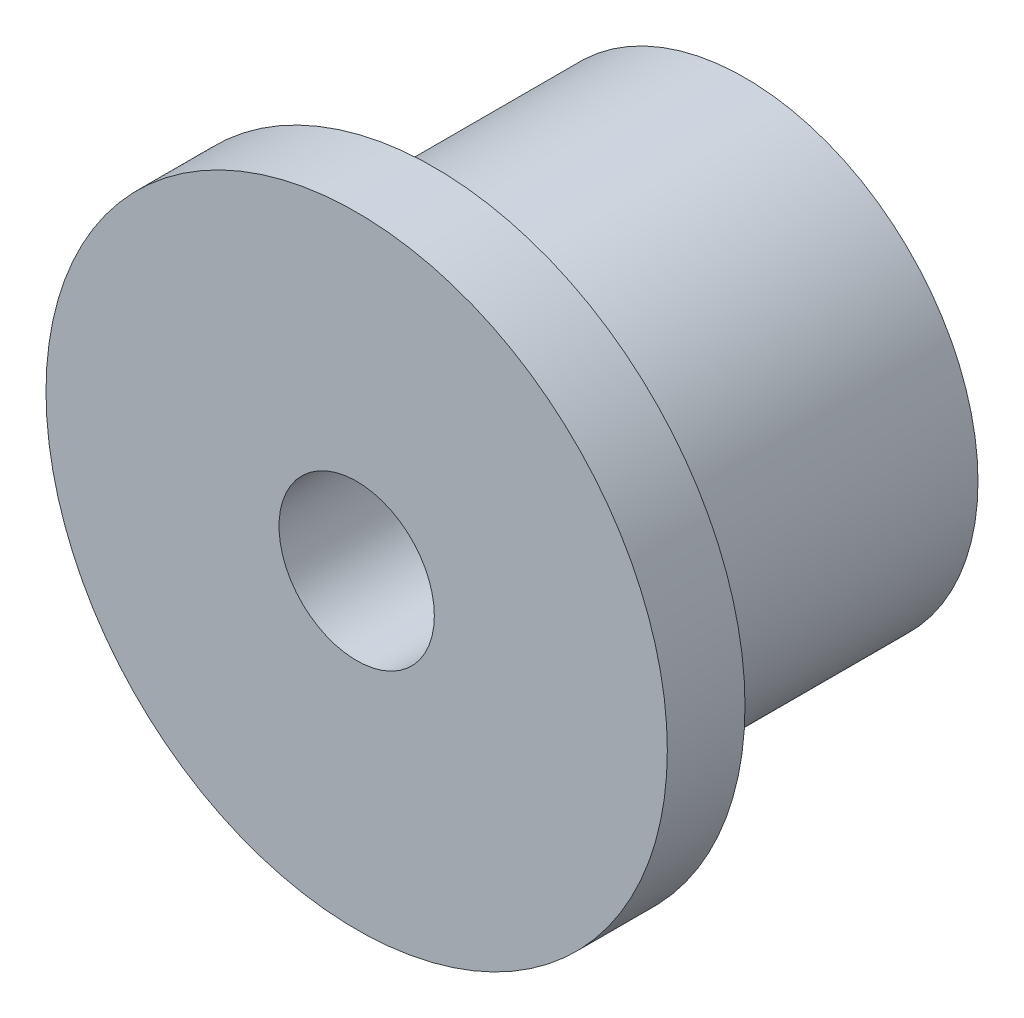
ISO-10303-21;
HEADER;
FILE_DESCRIPTION(('STEP AP214'),'2;1');
FILE_NAME('part.step','',(''),(''),'','','');
FILE_SCHEMA(('AUTOMOTIVE_DESIGN { 1 0 10303 214 1 1 1 1 }'));
ENDSEC;
DATA;
#1=APPLICATION_CONTEXT('core data for automotive mechanical design processes');
#2=APPLICATION_PROTOCOL_DEFINITION('international standard','automotive_design',2000,#1);
#3=PRODUCT_CONTEXT('',#1,'mechanical');
#4=PRODUCT('Part','Part','',(#3));
#5=PRODUCT_RELATED_PRODUCT_CATEGORY('part','',(#4));
#6=PRODUCT_DEFINITION_FORMATION('','',#4);
#7=PRODUCT_DEFINITION_CONTEXT('part definition',#1,'design');
#8=PRODUCT_DEFINITION('design','',#6,#7);
#9=PRODUCT_DEFINITION_SHAPE('','',#8);
#10=(LENGTH_UNIT() NAMED_UNIT(*) SI_UNIT(.MILLI.,.METRE.));
#11=(NAMED_UNIT(*) PLANE_ANGLE_UNIT() SI_UNIT($,.RADIAN.));
#12=(NAMED_UNIT(*) SI_UNIT($,.STERADIAN.) SOLID_ANGLE_UNIT());
#13=UNCERTAINTY_MEASURE_WITH_UNIT(LENGTH_MEASURE(1.E-05),#10,'distance_accuracy_value','');
#14=(GEOMETRIC_REPRESENTATION_CONTEXT(3) GLOBAL_UNCERTAINTY_ASSIGNED_CONTEXT((#13)) GLOBAL_UNIT_ASSIGNED_CONTEXT((#10,
#11,#12)) REPRESENTATION_CONTEXT('',''));
#15=CARTESIAN_POINT('',(0.,0.,0.));
#16=DIRECTION('',(0.,0.,1.));
#17=DIRECTION('',(1.,0.,0.));
#18=AXIS2_PLACEMENT_3D('',#15,#16,#17);
#19=CARTESIAN_POINT('',(0.,0.,-6.35));
#20=DIRECTION('',(0.,0.,1.));
#21=DIRECTION('',(1.,0.,0.));
#22=AXIS2_PLACEMENT_3D('',#19,#20,#21);
#23=CYLINDRICAL_SURFACE('',#22,25.4);
#24=CARTESIAN_POINT('',(0.,0.,-6.35));
#25=DIRECTION('',(0.,0.,1.));
#26=DIRECTION('',(1.,0.,0.));
#27=AXIS2_PLACEMENT_3D('',#24,#25,#26);
#28=CIRCLE('',#27,25.4);
#29=CARTESIAN_POINT('',(25.4,0.,-6.35));
#30=VERTEX_POINT('',#29);
#31=EDGE_CURVE('E53',#30,#30,#28,.T.);
#32=ORIENTED_EDGE('',*,*,#31,.T.);
#33=EDGE_LOOP('',(#32));
#34=FACE_BOUND('',#33,.T.);
#35=CARTESIAN_POINT('',(0.,0.,0.));
#36=DIRECTION('',(0.,0.,1.));
#37=DIRECTION('',(1.,0.,0.));
#38=AXIS2_PLACEMENT_3D('',#35,#36,#37);
#39=CIRCLE('',#38,25.4);
#40=CARTESIAN_POINT('',(25.4,0.,0.));
#41=VERTEX_POINT('',#40);
#42=EDGE_CURVE('E48',#41,#41,#39,.T.);
#43=ORIENTED_EDGE('',*,*,#42,.F.);
#44=EDGE_LOOP('',(#43));
#45=FACE_BOUND('',#44,.T.);
#46=ADVANCED_FACE('F45',(#34,#45),#23,.T.);
#47=CARTESIAN_POINT('',(0.,0.,-6.35));
#48=DIRECTION('',(0.,0.,1.));
#49=DIRECTION('',(1.,0.,0.));
#50=AXIS2_PLACEMENT_3D('',#47,#48,#49);
#51=PLANE('',#50);
#52=CARTESIAN_POINT('',(0.,0.,-6.35));
#53=DIRECTION('',(0.,0.,-1.));
#54=DIRECTION('',(-1.,0.,0.));
#55=AXIS2_PLACEMENT_3D('',#52,#53,#54);
#56=CIRCLE('',#55,19.05);
#57=CARTESIAN_POINT('',(-19.05,0.,-6.35));
#58=VERTEX_POINT('',#57);
#59=EDGE_CURVE('E10',#58,#58,#56,.T.);
#60=ORIENTED_EDGE('',*,*,#59,.F.);
#61=EDGE_LOOP('',(#60));
#62=FACE_BOUND('',#61,.T.);
#63=ORIENTED_EDGE('',*,*,#31,.F.);
#64=EDGE_LOOP('',(#63));
#65=FACE_BOUND('',#64,.T.);
#66=ADVANCED_FACE('F86',(#62,#65),#51,.F.);
#67=CARTESIAN_POINT('',(0.,0.,0.));
#68=DIRECTION('',(0.,0.,1.));
#69=DIRECTION('',(1.,0.,0.));
#70=AXIS2_PLACEMENT_3D('',#67,#68,#69);
#71=PLANE('',#70);
#72=CARTESIAN_POINT('',(0.,0.,0.));
#73=DIRECTION('',(0.,0.,1.));
#74=DIRECTION('',(1.,0.,0.));
#75=AXIS2_PLACEMENT_3D('',#72,#73,#74);
#76=CIRCLE('',#75,6.35);
#77=CARTESIAN_POINT('',(6.35,0.,0.));
#78=VERTEX_POINT('',#77);
#79=EDGE_CURVE('E65',#78,#78,#76,.T.);
#80=ORIENTED_EDGE('',*,*,#79,.F.);
#81=EDGE_LOOP('',(#80));
#82=FACE_BOUND('',#81,.T.);
#83=ORIENTED_EDGE('',*,*,#42,.T.);
#84=EDGE_LOOP('',(#83));
#85=FACE_BOUND('',#84,.T.);
#86=ADVANCED_FACE('F82',(#82,#85),#71,.T.);
#87=CARTESIAN_POINT('',(0.,0.,-31.75));
#88=DIRECTION('',(0.,0.,1.));
#89=DIRECTION('',(1.,0.,0.));
#90=AXIS2_PLACEMENT_3D('',#87,#88,#89);
#91=CYLINDRICAL_SURFACE('',#90,19.05);
#92=CARTESIAN_POINT('',(0.,0.,-31.75));
#93=DIRECTION('',(0.,0.,-1.));
#94=DIRECTION('',(-1.,0.,0.));
#95=AXIS2_PLACEMENT_3D('',#92,#93,#94);
#96=CIRCLE('',#95,19.05);
#97=CARTESIAN_POINT('',(-19.05,0.,-31.75));
#98=VERTEX_POINT('',#97);
#99=EDGE_CURVE('E60',#98,#98,#96,.T.);
#100=ORIENTED_EDGE('',*,*,#99,.F.);
#101=EDGE_LOOP('',(#100));
#102=FACE_BOUND('',#101,.T.);
#103=ORIENTED_EDGE('',*,*,#59,.T.);
#104=EDGE_LOOP('',(#103));
#105=FACE_BOUND('',#104,.T.);
#106=ADVANCED_FACE('F85',(#102,#105),#91,.T.);
#107=CARTESIAN_POINT('',(0.,0.,-31.75));
#108=DIRECTION('',(0.,0.,-1.));
#109=DIRECTION('',(-1.,0.,0.));
#110=AXIS2_PLACEMENT_3D('',#107,#108,#109);
#111=PLANE('',#110);
#112=CARTESIAN_POINT('',(0.,0.,-31.75));
#113=DIRECTION('',(0.,0.,1.));
#114=DIRECTION('',(1.,0.,0.));
#115=AXIS2_PLACEMENT_3D('',#112,#113,#114);
#116=CIRCLE('',#115,6.35);
#117=CARTESIAN_POINT('',(6.35,0.,-31.75));
#118=VERTEX_POINT('',#117);
#119=EDGE_CURVE('E64',#118,#118,#116,.T.);
#120=ORIENTED_EDGE('',*,*,#119,.T.);
#121=EDGE_LOOP('',(#120));
#122=FACE_BOUND('',#121,.T.);
#123=ORIENTED_EDGE('',*,*,#99,.T.);
#124=EDGE_LOOP('',(#123));
#125=FACE_BOUND('',#124,.T.);
#126=ADVANCED_FACE('F73',(#122,#125),#111,.T.);
#127=CARTESIAN_POINT('',(0.,0.,-31.75));
#128=DIRECTION('',(0.,0.,1.));
#129=DIRECTION('',(1.,0.,0.));
#130=AXIS2_PLACEMENT_3D('',#127,#128,#129);
#131=CYLINDRICAL_SURFACE('',#130,6.35);
#132=ORIENTED_EDGE('',*,*,#119,.F.);
#133=EDGE_LOOP('',(#132));
#134=FACE_BOUND('',#133,.T.);
#135=ORIENTED_EDGE('',*,*,#79,.T.);
#136=EDGE_LOOP('',(#135));
#137=FACE_BOUND('',#136,.T.);
#138=ADVANCED_FACE('F76',(#134,#137),#131,.F.);
#139=CLOSED_SHELL('',(#46,#66,#86,#106,#126,#138));
#140=MANIFOLD_SOLID_BREP('B2',#139);
#141=ADVANCED_BREP_SHAPE_REPRESENTATION('',(#18,#140),#14);
#142=SHAPE_DEFINITION_REPRESENTATION(#9,#141);
ENDSEC;
END-ISO-10303-21;
